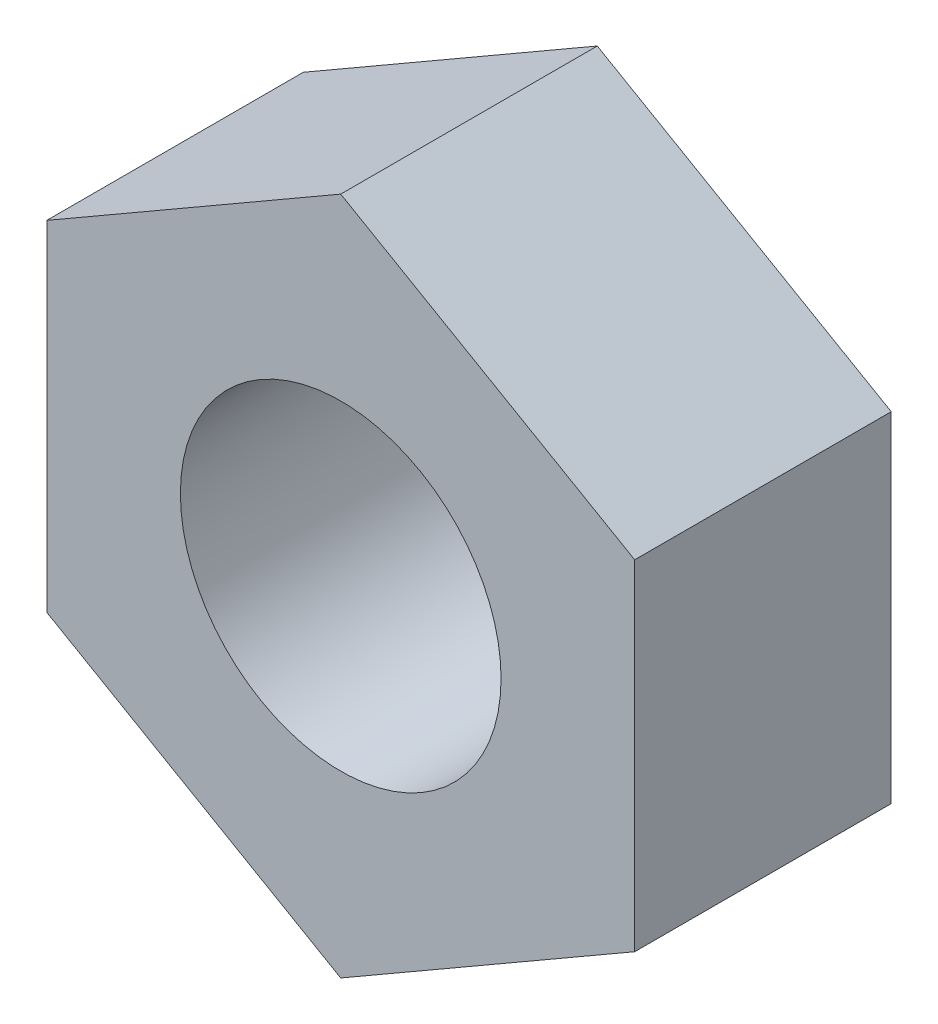
ISO-10303-21;
HEADER;
FILE_DESCRIPTION(('STEP AP214'),'2;1');
FILE_NAME('part.step','',(''),(''),'','','');
FILE_SCHEMA(('AUTOMOTIVE_DESIGN { 1 0 10303 214 1 1 1 1 }'));
ENDSEC;
DATA;
#1=APPLICATION_CONTEXT('core data for automotive mechanical design processes');
#2=APPLICATION_PROTOCOL_DEFINITION('international standard','automotive_design',2000,#1);
#3=PRODUCT_CONTEXT('',#1,'mechanical');
#4=PRODUCT('Part','Part','',(#3));
#5=PRODUCT_RELATED_PRODUCT_CATEGORY('part','',(#4));
#6=PRODUCT_DEFINITION_FORMATION('','',#4);
#7=PRODUCT_DEFINITION_CONTEXT('part definition',#1,'design');
#8=PRODUCT_DEFINITION('design','',#6,#7);
#9=PRODUCT_DEFINITION_SHAPE('','',#8);
#10=(LENGTH_UNIT() NAMED_UNIT(*) SI_UNIT(.MILLI.,.METRE.));
#11=(NAMED_UNIT(*) PLANE_ANGLE_UNIT() SI_UNIT($,.RADIAN.));
#12=(NAMED_UNIT(*) SI_UNIT($,.STERADIAN.) SOLID_ANGLE_UNIT());
#13=UNCERTAINTY_MEASURE_WITH_UNIT(LENGTH_MEASURE(1.E-05),#10,'distance_accuracy_value','');
#14=(GEOMETRIC_REPRESENTATION_CONTEXT(3) GLOBAL_UNCERTAINTY_ASSIGNED_CONTEXT((#13)) GLOBAL_UNIT_ASSIGNED_CONTEXT((#10,
#11,#12)) REPRESENTATION_CONTEXT('',''));
#15=CARTESIAN_POINT('',(0.,0.,0.));
#16=DIRECTION('',(0.,0.,1.));
#17=DIRECTION('',(1.,0.,0.));
#18=AXIS2_PLACEMENT_3D('',#15,#16,#17);
#19=CARTESIAN_POINT('',(0.,0.,2.4));
#20=DIRECTION('',(0.,0.,1.));
#21=DIRECTION('',(1.,0.,0.));
#22=AXIS2_PLACEMENT_3D('',#19,#20,#21);
#23=PLANE('',#22);
#24=DIRECTION('',(0.,1.,0.));
#25=VECTOR('',#24,1.);
#26=CARTESIAN_POINT('',(2.75,-1.58771324027147,2.4));
#27=LINE('',#26,#25);
#28=CARTESIAN_POINT('',(2.75,-1.58771324027147,2.4));
#29=VERTEX_POINT('',#28);
#30=CARTESIAN_POINT('',(2.75,1.58771324027147,2.4));
#31=VERTEX_POINT('',#30);
#32=EDGE_CURVE('E137',#29,#31,#27,.T.);
#33=ORIENTED_EDGE('',*,*,#32,.T.);
#34=DIRECTION('',(-0.866025403784439,0.5,0.));
#35=VECTOR('',#34,1.);
#36=CARTESIAN_POINT('',(2.75,1.58771324027147,2.4));
#37=LINE('',#36,#35);
#38=CARTESIAN_POINT('',(0.,3.17542648054294,2.4));
#39=VERTEX_POINT('',#38);
#40=EDGE_CURVE('E95',#31,#39,#37,.T.);
#41=ORIENTED_EDGE('',*,*,#40,.T.);
#42=DIRECTION('',(-0.866025403784439,-0.5,0.));
#43=VECTOR('',#42,1.);
#44=CARTESIAN_POINT('',(0.,3.17542648054294,2.4));
#45=LINE('',#44,#43);
#46=CARTESIAN_POINT('',(-2.75,1.58771324027147,2.4));
#47=VERTEX_POINT('',#46);
#48=EDGE_CURVE('E108',#39,#47,#45,.T.);
#49=ORIENTED_EDGE('',*,*,#48,.T.);
#50=DIRECTION('',(0.,-1.,0.));
#51=VECTOR('',#50,1.);
#52=CARTESIAN_POINT('',(-2.75,1.58771324027147,2.4));
#53=LINE('',#52,#51);
#54=CARTESIAN_POINT('',(-2.75,-1.58771324027147,2.4));
#55=VERTEX_POINT('',#54);
#56=EDGE_CURVE('E102',#47,#55,#53,.T.);
#57=ORIENTED_EDGE('',*,*,#56,.T.);
#58=DIRECTION('',(0.866025403784438,-0.5,0.));
#59=VECTOR('',#58,1.);
#60=CARTESIAN_POINT('',(-2.75,-1.58771324027147,2.4));
#61=LINE('',#60,#59);
#62=CARTESIAN_POINT('',(0.,-3.17542648054294,2.4));
#63=VERTEX_POINT('',#62);
#64=EDGE_CURVE('E106',#55,#63,#61,.T.);
#65=ORIENTED_EDGE('',*,*,#64,.T.);
#66=DIRECTION('',(0.866025403784438,0.5,0.));
#67=VECTOR('',#66,1.);
#68=CARTESIAN_POINT('',(0.,-3.17542648054294,2.4));
#69=LINE('',#68,#67);
#70=EDGE_CURVE('E58',#63,#29,#69,.T.);
#71=ORIENTED_EDGE('',*,*,#70,.T.);
#72=EDGE_LOOP('',(#33,#41,#49,#57,#65,#71));
#73=FACE_BOUND('',#72,.T.);
#74=CARTESIAN_POINT('',(0.,0.,2.4));
#75=DIRECTION('',(0.,0.,1.));
#76=DIRECTION('',(1.,0.,0.));
#77=AXIS2_PLACEMENT_3D('',#74,#75,#76);
#78=CIRCLE('',#77,1.5);
#79=CARTESIAN_POINT('',(1.5,0.,2.4));
#80=VERTEX_POINT('',#79);
#81=EDGE_CURVE('E130',#80,#80,#78,.T.);
#82=ORIENTED_EDGE('',*,*,#81,.F.);
#83=EDGE_LOOP('',(#82));
#84=FACE_BOUND('',#83,.T.);
#85=ADVANCED_FACE('F41',(#73,#84),#23,.T.);
#86=CARTESIAN_POINT('',(0.,0.,0.));
#87=DIRECTION('',(0.,0.,1.));
#88=DIRECTION('',(1.,0.,0.));
#89=AXIS2_PLACEMENT_3D('',#86,#87,#88);
#90=PLANE('',#89);
#91=DIRECTION('',(0.,1.,0.));
#92=VECTOR('',#91,1.);
#93=CARTESIAN_POINT('',(2.75,-1.58771324027147,0.));
#94=LINE('',#93,#92);
#95=CARTESIAN_POINT('',(2.75,-1.58771324027147,0.));
#96=VERTEX_POINT('',#95);
#97=CARTESIAN_POINT('',(2.75,1.58771324027147,0.));
#98=VERTEX_POINT('',#97);
#99=EDGE_CURVE('E126',#96,#98,#94,.T.);
#100=ORIENTED_EDGE('',*,*,#99,.F.);
#101=DIRECTION('',(0.866025403784438,0.5,0.));
#102=VECTOR('',#101,1.);
#103=CARTESIAN_POINT('',(0.,-3.17542648054294,0.));
#104=LINE('',#103,#102);
#105=CARTESIAN_POINT('',(0.,-3.17542648054294,0.));
#106=VERTEX_POINT('',#105);
#107=EDGE_CURVE('E87',#106,#96,#104,.T.);
#108=ORIENTED_EDGE('',*,*,#107,.F.);
#109=DIRECTION('',(0.866025403784438,-0.5,0.));
#110=VECTOR('',#109,1.);
#111=CARTESIAN_POINT('',(-2.75,-1.58771324027147,0.));
#112=LINE('',#111,#110);
#113=CARTESIAN_POINT('',(-2.75,-1.58771324027147,0.));
#114=VERTEX_POINT('',#113);
#115=EDGE_CURVE('E81',#114,#106,#112,.T.);
#116=ORIENTED_EDGE('',*,*,#115,.F.);
#117=DIRECTION('',(0.,-1.,0.));
#118=VECTOR('',#117,1.);
#119=CARTESIAN_POINT('',(-2.75,1.58771324027147,0.));
#120=LINE('',#119,#118);
#121=CARTESIAN_POINT('',(-2.75,1.58771324027147,0.));
#122=VERTEX_POINT('',#121);
#123=EDGE_CURVE('E116',#122,#114,#120,.T.);
#124=ORIENTED_EDGE('',*,*,#123,.F.);
#125=DIRECTION('',(-0.866025403784439,-0.5,0.));
#126=VECTOR('',#125,1.);
#127=CARTESIAN_POINT('',(0.,3.17542648054294,0.));
#128=LINE('',#127,#126);
#129=CARTESIAN_POINT('',(0.,3.17542648054294,0.));
#130=VERTEX_POINT('',#129);
#131=EDGE_CURVE('E132',#130,#122,#128,.T.);
#132=ORIENTED_EDGE('',*,*,#131,.F.);
#133=DIRECTION('',(-0.866025403784439,0.5,0.));
#134=VECTOR('',#133,1.);
#135=CARTESIAN_POINT('',(2.75,1.58771324027147,0.));
#136=LINE('',#135,#134);
#137=EDGE_CURVE('E129',#98,#130,#136,.T.);
#138=ORIENTED_EDGE('',*,*,#137,.F.);
#139=EDGE_LOOP('',(#100,#108,#116,#124,#132,#138));
#140=FACE_BOUND('',#139,.T.);
#141=CARTESIAN_POINT('',(0.,0.,0.));
#142=DIRECTION('',(0.,0.,1.));
#143=DIRECTION('',(1.,0.,0.));
#144=AXIS2_PLACEMENT_3D('',#141,#142,#143);
#145=CIRCLE('',#144,1.5);
#146=CARTESIAN_POINT('',(1.5,0.,0.));
#147=VERTEX_POINT('',#146);
#148=EDGE_CURVE('E230',#147,#147,#145,.T.);
#149=ORIENTED_EDGE('',*,*,#148,.T.);
#150=EDGE_LOOP('',(#149));
#151=FACE_BOUND('',#150,.T.);
#152=ADVANCED_FACE('F146',(#140,#151),#90,.F.);
#153=CARTESIAN_POINT('',(2.75,-1.58771324027147,2.4));
#154=DIRECTION('',(-1.,0.,0.));
#155=DIRECTION('',(0.,0.,1.));
#156=AXIS2_PLACEMENT_3D('',#153,#154,#155);
#157=PLANE('',#156);
#158=ORIENTED_EDGE('',*,*,#99,.T.);
#159=DIRECTION('',(0.,0.,-1.));
#160=VECTOR('',#159,1.);
#161=CARTESIAN_POINT('',(2.75,1.58771324027147,2.4));
#162=LINE('',#161,#160);
#163=EDGE_CURVE('E11',#31,#98,#162,.T.);
#164=ORIENTED_EDGE('',*,*,#163,.F.);
#165=ORIENTED_EDGE('',*,*,#32,.F.);
#166=DIRECTION('',(0.,0.,-1.));
#167=VECTOR('',#166,1.);
#168=CARTESIAN_POINT('',(2.75,-1.58771324027147,2.4));
#169=LINE('',#168,#167);
#170=EDGE_CURVE('E122',#29,#96,#169,.T.);
#171=ORIENTED_EDGE('',*,*,#170,.T.);
#172=EDGE_LOOP('',(#158,#164,#165,#171));
#173=FACE_BOUND('',#172,.T.);
#174=ADVANCED_FACE('F43',(#173),#157,.F.);
#175=CARTESIAN_POINT('',(2.75,1.58771324027147,2.4));
#176=DIRECTION('',(-0.5,-0.866025403784439,0.));
#177=DIRECTION('',(0.866025403784439,-0.5,0.));
#178=AXIS2_PLACEMENT_3D('',#175,#176,#177);
#179=PLANE('',#178);
#180=ORIENTED_EDGE('',*,*,#137,.T.);
#181=DIRECTION('',(0.,0.,-1.));
#182=VECTOR('',#181,1.);
#183=CARTESIAN_POINT('',(0.,3.17542648054294,2.4));
#184=LINE('',#183,#182);
#185=EDGE_CURVE('E50',#39,#130,#184,.T.);
#186=ORIENTED_EDGE('',*,*,#185,.F.);
#187=ORIENTED_EDGE('',*,*,#40,.F.);
#188=ORIENTED_EDGE('',*,*,#163,.T.);
#189=EDGE_LOOP('',(#180,#186,#187,#188));
#190=FACE_BOUND('',#189,.T.);
#191=ADVANCED_FACE('F171',(#190),#179,.F.);
#192=CARTESIAN_POINT('',(0.,3.17542648054294,2.4));
#193=DIRECTION('',(0.5,-0.866025403784439,0.));
#194=DIRECTION('',(0.866025403784439,0.5,0.));
#195=AXIS2_PLACEMENT_3D('',#192,#193,#194);
#196=PLANE('',#195);
#197=ORIENTED_EDGE('',*,*,#131,.T.);
#198=DIRECTION('',(0.,0.,-1.));
#199=VECTOR('',#198,1.);
#200=CARTESIAN_POINT('',(-2.75,1.58771324027147,2.4));
#201=LINE('',#200,#199);
#202=EDGE_CURVE('E117',#47,#122,#201,.T.);
#203=ORIENTED_EDGE('',*,*,#202,.F.);
#204=ORIENTED_EDGE('',*,*,#48,.F.);
#205=ORIENTED_EDGE('',*,*,#185,.T.);
#206=EDGE_LOOP('',(#197,#203,#204,#205));
#207=FACE_BOUND('',#206,.T.);
#208=ADVANCED_FACE('F143',(#207),#196,.F.);
#209=CARTESIAN_POINT('',(-2.75,1.58771324027147,2.4));
#210=DIRECTION('',(1.,0.,0.));
#211=DIRECTION('',(0.,1.,0.));
#212=AXIS2_PLACEMENT_3D('',#209,#210,#211);
#213=PLANE('',#212);
#214=ORIENTED_EDGE('',*,*,#123,.T.);
#215=DIRECTION('',(0.,0.,-1.));
#216=VECTOR('',#215,1.);
#217=CARTESIAN_POINT('',(-2.75,-1.58771324027147,2.4));
#218=LINE('',#217,#216);
#219=EDGE_CURVE('E113',#55,#114,#218,.T.);
#220=ORIENTED_EDGE('',*,*,#219,.F.);
#221=ORIENTED_EDGE('',*,*,#56,.F.);
#222=ORIENTED_EDGE('',*,*,#202,.T.);
#223=EDGE_LOOP('',(#214,#220,#221,#222));
#224=FACE_BOUND('',#223,.T.);
#225=ADVANCED_FACE('F114',(#224),#213,.F.);
#226=CARTESIAN_POINT('',(-2.75,-1.58771324027147,2.4));
#227=DIRECTION('',(0.5,0.866025403784438,0.));
#228=DIRECTION('',(-0.866025403784439,0.5,0.));
#229=AXIS2_PLACEMENT_3D('',#226,#227,#228);
#230=PLANE('',#229);
#231=ORIENTED_EDGE('',*,*,#115,.T.);
#232=DIRECTION('',(0.,0.,-1.));
#233=VECTOR('',#232,1.);
#234=CARTESIAN_POINT('',(0.,-3.17542648054294,2.4));
#235=LINE('',#234,#233);
#236=EDGE_CURVE('E118',#63,#106,#235,.T.);
#237=ORIENTED_EDGE('',*,*,#236,.F.);
#238=ORIENTED_EDGE('',*,*,#64,.F.);
#239=ORIENTED_EDGE('',*,*,#219,.T.);
#240=EDGE_LOOP('',(#231,#237,#238,#239));
#241=FACE_BOUND('',#240,.T.);
#242=ADVANCED_FACE('F120',(#241),#230,.F.);
#243=CARTESIAN_POINT('',(0.,-3.17542648054294,2.4));
#244=DIRECTION('',(-0.5,0.866025403784439,0.));
#245=DIRECTION('',(-0.866025403784439,-0.5,0.));
#246=AXIS2_PLACEMENT_3D('',#243,#244,#245);
#247=PLANE('',#246);
#248=ORIENTED_EDGE('',*,*,#107,.T.);
#249=ORIENTED_EDGE('',*,*,#170,.F.);
#250=ORIENTED_EDGE('',*,*,#70,.F.);
#251=ORIENTED_EDGE('',*,*,#236,.T.);
#252=EDGE_LOOP('',(#248,#249,#250,#251));
#253=FACE_BOUND('',#252,.T.);
#254=ADVANCED_FACE('F151',(#253),#247,.F.);
#255=CARTESIAN_POINT('',(0.,0.,2.4));
#256=DIRECTION('',(0.,0.,-1.));
#257=DIRECTION('',(-1.,0.,0.));
#258=AXIS2_PLACEMENT_3D('',#255,#256,#257);
#259=CYLINDRICAL_SURFACE('',#258,1.5);
#260=ORIENTED_EDGE('',*,*,#81,.T.);
#261=EDGE_LOOP('',(#260));
#262=FACE_BOUND('',#261,.T.);
#263=ORIENTED_EDGE('',*,*,#148,.F.);
#264=EDGE_LOOP('',(#263));
#265=FACE_BOUND('',#264,.T.);
#266=ADVANCED_FACE('F153',(#262,#265),#259,.F.);
#267=CLOSED_SHELL('',(#85,#152,#174,#191,#208,#225,#242,#254,#266));
#268=MANIFOLD_SOLID_BREP('B2',#267);
#269=ADVANCED_BREP_SHAPE_REPRESENTATION('',(#18,#268),#14);
#270=SHAPE_DEFINITION_REPRESENTATION(#9,#269);
ENDSEC;
END-ISO-10303-21;
